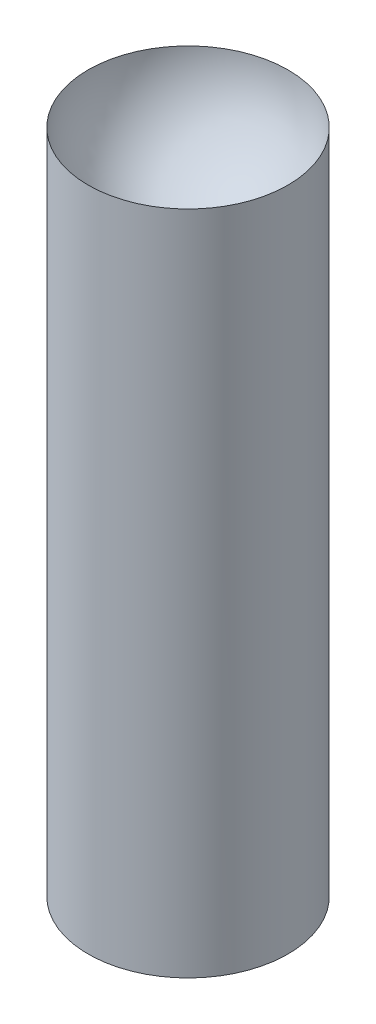
ISO-10303-21;
HEADER;
FILE_DESCRIPTION(('STEP AP214'),'2;1');
FILE_NAME('part.step','',(''),(''),'','','');
FILE_SCHEMA(('AUTOMOTIVE_DESIGN { 1 0 10303 214 1 1 1 1 }'));
ENDSEC;
DATA;
#1=APPLICATION_CONTEXT('core data for automotive mechanical design processes');
#2=APPLICATION_PROTOCOL_DEFINITION('international standard','automotive_design',2000,#1);
#3=PRODUCT_CONTEXT('',#1,'mechanical');
#4=PRODUCT('Part','Part','',(#3));
#5=PRODUCT_RELATED_PRODUCT_CATEGORY('part','',(#4));
#6=PRODUCT_DEFINITION_FORMATION('','',#4);
#7=PRODUCT_DEFINITION_CONTEXT('part definition',#1,'design');
#8=PRODUCT_DEFINITION('design','',#6,#7);
#9=PRODUCT_DEFINITION_SHAPE('','',#8);
#10=(LENGTH_UNIT() NAMED_UNIT(*) SI_UNIT(.MILLI.,.METRE.));
#11=(NAMED_UNIT(*) PLANE_ANGLE_UNIT() SI_UNIT($,.RADIAN.));
#12=(NAMED_UNIT(*) SI_UNIT($,.STERADIAN.) SOLID_ANGLE_UNIT());
#13=UNCERTAINTY_MEASURE_WITH_UNIT(LENGTH_MEASURE(1.E-05),#10,'distance_accuracy_value','');
#14=(GEOMETRIC_REPRESENTATION_CONTEXT(3) GLOBAL_UNCERTAINTY_ASSIGNED_CONTEXT((#13)) GLOBAL_UNIT_ASSIGNED_CONTEXT((#10,
#11,#12)) REPRESENTATION_CONTEXT('',''));
#15=CARTESIAN_POINT('',(0.,0.,0.));
#16=DIRECTION('',(0.,0.,1.));
#17=DIRECTION('',(1.,0.,0.));
#18=AXIS2_PLACEMENT_3D('',#15,#16,#17);
#19=CARTESIAN_POINT('',(0.,76.2,0.));
#20=DIRECTION('',(0.,-1.,0.));
#21=DIRECTION('',(0.,0.,-1.));
#22=AXIS2_PLACEMENT_3D('',#19,#20,#21);
#23=CYLINDRICAL_SURFACE('',#22,11.43);
#24=CARTESIAN_POINT('',(0.,76.2,0.));
#25=DIRECTION('',(0.,1.,0.));
#26=DIRECTION('',(0.,0.,1.));
#27=AXIS2_PLACEMENT_3D('',#24,#25,#26);
#28=CIRCLE('',#27,11.43);
#29=CARTESIAN_POINT('',(0.,76.2,-11.43));
#30=VERTEX_POINT('',#29);
#31=EDGE_CURVE('E37',#30,#30,#28,.F.);
#32=CARTESIAN_POINT('',(0.,0.,0.));
#33=DIRECTION('',(0.,1.,0.));
#34=DIRECTION('',(0.,0.,1.));
#35=AXIS2_PLACEMENT_3D('',#32,#33,#34);
#36=CIRCLE('',#35,11.43);
#37=CARTESIAN_POINT('',(0.,0.,-11.43));
#38=VERTEX_POINT('',#37);
#39=EDGE_CURVE('E10',#38,#38,#36,.T.);
#40=CARTESIAN_POINT('',(0.,76.2,-11.43));
#41=CARTESIAN_POINT('',(0.,75.40625,-11.43));
#42=CARTESIAN_POINT('',(0.,74.6125,-11.43));
#43=CARTESIAN_POINT('',(0.,73.025,-11.43));
#44=CARTESIAN_POINT('',(0.,72.23125,-11.43));
#45=CARTESIAN_POINT('',(0.,70.64375,-11.43));
#46=CARTESIAN_POINT('',(0.,69.85,-11.43));
#47=CARTESIAN_POINT('',(0.,68.2625,-11.43));
#48=CARTESIAN_POINT('',(0.,67.46875,-11.43));
#49=CARTESIAN_POINT('',(0.,65.88125,-11.43));
#50=CARTESIAN_POINT('',(0.,65.0875,-11.43));
#51=CARTESIAN_POINT('',(0.,63.5,-11.43));
#52=CARTESIAN_POINT('',(0.,62.70625,-11.43));
#53=CARTESIAN_POINT('',(0.,61.11875,-11.43));
#54=CARTESIAN_POINT('',(0.,60.325,-11.43));
#55=CARTESIAN_POINT('',(0.,58.7375,-11.43));
#56=CARTESIAN_POINT('',(0.,57.94375,-11.43));
#57=CARTESIAN_POINT('',(0.,56.35625,-11.43));
#58=CARTESIAN_POINT('',(0.,55.5625,-11.43));
#59=CARTESIAN_POINT('',(0.,53.975,-11.43));
#60=CARTESIAN_POINT('',(0.,53.18125,-11.43));
#61=CARTESIAN_POINT('',(0.,51.59375,-11.43));
#62=CARTESIAN_POINT('',(0.,50.8,-11.43));
#63=CARTESIAN_POINT('',(0.,49.2125,-11.43));
#64=CARTESIAN_POINT('',(0.,48.41875,-11.43));
#65=CARTESIAN_POINT('',(0.,46.83125,-11.43));
#66=CARTESIAN_POINT('',(0.,46.0375,-11.43));
#67=CARTESIAN_POINT('',(0.,44.45,-11.43));
#68=CARTESIAN_POINT('',(0.,43.65625,-11.43));
#69=CARTESIAN_POINT('',(0.,42.06875,-11.43));
#70=CARTESIAN_POINT('',(0.,41.275,-11.43));
#71=CARTESIAN_POINT('',(0.,39.6875,-11.43));
#72=CARTESIAN_POINT('',(0.,38.89375,-11.43));
#73=CARTESIAN_POINT('',(0.,37.30625,-11.43));
#74=CARTESIAN_POINT('',(0.,36.5125,-11.43));
#75=CARTESIAN_POINT('',(0.,34.925,-11.43));
#76=CARTESIAN_POINT('',(0.,34.13125,-11.43));
#77=CARTESIAN_POINT('',(0.,32.54375,-11.43));
#78=CARTESIAN_POINT('',(0.,31.75,-11.43));
#79=CARTESIAN_POINT('',(0.,30.1625,-11.43));
#80=CARTESIAN_POINT('',(0.,29.36875,-11.43));
#81=CARTESIAN_POINT('',(0.,27.78125,-11.43));
#82=CARTESIAN_POINT('',(0.,26.9875,-11.43));
#83=CARTESIAN_POINT('',(0.,25.4,-11.43));
#84=CARTESIAN_POINT('',(0.,24.60625,-11.43));
#85=CARTESIAN_POINT('',(0.,23.01875,-11.43));
#86=CARTESIAN_POINT('',(0.,22.225,-11.43));
#87=CARTESIAN_POINT('',(0.,20.6375,-11.43));
#88=CARTESIAN_POINT('',(0.,19.84375,-11.43));
#89=CARTESIAN_POINT('',(0.,18.25625,-11.43));
#90=CARTESIAN_POINT('',(0.,17.4625,-11.43));
#91=CARTESIAN_POINT('',(0.,15.875,-11.43));
#92=CARTESIAN_POINT('',(0.,15.08125,-11.43));
#93=CARTESIAN_POINT('',(0.,13.49375,-11.43));
#94=CARTESIAN_POINT('',(0.,12.7,-11.43));
#95=CARTESIAN_POINT('',(0.,11.1125,-11.43));
#96=CARTESIAN_POINT('',(0.,10.31875,-11.43));
#97=CARTESIAN_POINT('',(0.,8.73125,-11.43));
#98=CARTESIAN_POINT('',(0.,7.93750000000001,-11.43));
#99=CARTESIAN_POINT('',(0.,6.35,-11.43));
#100=CARTESIAN_POINT('',(0.,5.55625,-11.43));
#101=CARTESIAN_POINT('',(0.,3.96875,-11.43));
#102=CARTESIAN_POINT('',(0.,3.175,-11.43));
#103=CARTESIAN_POINT('',(0.,1.5875,-11.43));
#104=CARTESIAN_POINT('',(0.,0.793750000000001,-11.43));
#105=CARTESIAN_POINT('',(0.,0.,-11.43));
#106=B_SPLINE_CURVE_WITH_KNOTS('',3,(#40,#41,#42,#43,#44,#45,#46,#47,#48,#49,#50,#51,#52,#53,
#54,#55,#56,#57,#58,#59,#60,#61,#62,#63,#64,#65,#66,#67,#68,#69,#70,#71,#72,#73,#74,#75,#76,#77,
#78,#79,#80,#81,#82,#83,#84,#85,#86,#87,#88,#89,#90,#91,#92,#93,#94,#95,#96,#97,#98,#99,#100,
#101,#102,#103,#104,#105),.UNSPECIFIED.,.F.,.F.,(4,2,2,2,2,2,2,2,2,2,2,2,2,2,2,2,2,2,2,2,2,2,2,
2,2,2,2,2,2,2,2,2,4),(0.,2.38124999999999,4.76249999999999,7.14374999999999,9.52499999999999,
11.90625,14.2875,16.66875,19.05,21.43125,23.8125,26.19375,28.575,30.95625,33.3375,35.71875,38.1,
40.48125,42.8625,45.24375,47.625,50.00625,52.3875,54.76875,57.15,59.53125,61.9125,64.29375,
66.675,69.05625,71.4375,73.81875,76.2),.UNSPECIFIED.);
#107=EDGE_CURVE('BSEAM31',#30,#38,#106,.T.);
#108=ORIENTED_EDGE('',*,*,#31,.T.);
#109=ORIENTED_EDGE('',*,*,#39,.T.);
#110=ORIENTED_EDGE('',*,*,#107,.T.);
#111=ORIENTED_EDGE('',*,*,#107,.F.);
#112=EDGE_LOOP('',(#108,#110,#109,#111));
#113=FACE_BOUND('',#112,.T.);
#114=ADVANCED_FACE('F31',(#113),#23,.T.);
#115=CARTESIAN_POINT('',(0.,0.,0.));
#116=DIRECTION('',(0.,1.,0.));
#117=DIRECTION('',(0.,0.,1.));
#118=AXIS2_PLACEMENT_3D('',#115,#116,#117);
#119=PLANE('',#118);
#120=ORIENTED_EDGE('',*,*,#39,.F.);
#121=EDGE_LOOP('',(#120));
#122=FACE_BOUND('',#121,.T.);
#123=ADVANCED_FACE('F46',(#122),#119,.F.);
#124=CARTESIAN_POINT('',(0.,76.2,0.));
#125=DIRECTION('',(0.,0.,-1.));
#126=DIRECTION('',(1.,0.,0.));
#127=AXIS2_PLACEMENT_3D('',#124,#125,#126);
#128=SPHERICAL_SURFACE('',#127,11.43);
#129=CARTESIAN_POINT('',(0.,76.2,0.));
#130=DIRECTION('',(0.,1.,0.));
#131=DIRECTION('',(0.,0.,1.));
#132=AXIS2_PLACEMENT_3D('',#129,#130,#131);
#133=SPHERICAL_SURFACE('',#132,11.43);
#134=ORIENTED_EDGE('',*,*,#31,.F.);
#135=EDGE_LOOP('',(#134));
#136=FACE_BOUND('',#135,.T.);
#137=ADVANCED_FACE('F44',(#136),#133,.F.);
#138=CLOSED_SHELL('',(#114,#123,#137));
#139=MANIFOLD_SOLID_BREP('B2',#138);
#140=ADVANCED_BREP_SHAPE_REPRESENTATION('',(#18,#139),#14);
#141=SHAPE_DEFINITION_REPRESENTATION(#9,#140);
ENDSEC;
END-ISO-10303-21;
